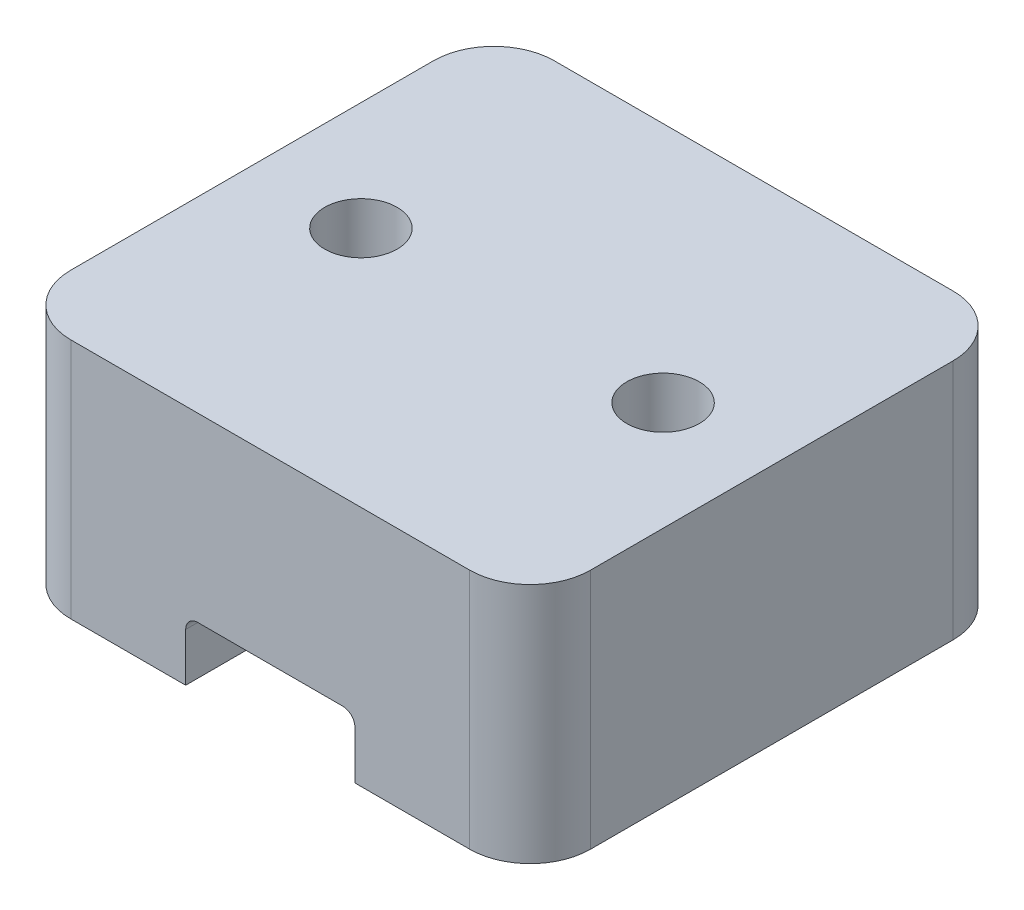
ISO-10303-21;
HEADER;
FILE_DESCRIPTION(('STEP AP214'),'2;1');
FILE_NAME('part.step','',(''),(''),'','','');
FILE_SCHEMA(('AUTOMOTIVE_DESIGN { 1 0 10303 214 1 1 1 1 }'));
ENDSEC;
DATA;
#1=APPLICATION_CONTEXT('core data for automotive mechanical design processes');
#2=APPLICATION_PROTOCOL_DEFINITION('international standard','automotive_design',2000,#1);
#3=PRODUCT_CONTEXT('',#1,'mechanical');
#4=PRODUCT('Part','Part','',(#3));
#5=PRODUCT_RELATED_PRODUCT_CATEGORY('part','',(#4));
#6=PRODUCT_DEFINITION_FORMATION('','',#4);
#7=PRODUCT_DEFINITION_CONTEXT('part definition',#1,'design');
#8=PRODUCT_DEFINITION('design','',#6,#7);
#9=PRODUCT_DEFINITION_SHAPE('','',#8);
#10=(LENGTH_UNIT() NAMED_UNIT(*) SI_UNIT(.MILLI.,.METRE.));
#11=(NAMED_UNIT(*) PLANE_ANGLE_UNIT() SI_UNIT($,.RADIAN.));
#12=(NAMED_UNIT(*) SI_UNIT($,.STERADIAN.) SOLID_ANGLE_UNIT());
#13=UNCERTAINTY_MEASURE_WITH_UNIT(LENGTH_MEASURE(1.E-05),#10,'distance_accuracy_value','');
#14=(GEOMETRIC_REPRESENTATION_CONTEXT(3) GLOBAL_UNCERTAINTY_ASSIGNED_CONTEXT((#13)) GLOBAL_UNIT_ASSIGNED_CONTEXT((#10,
#11,#12)) REPRESENTATION_CONTEXT('',''));
#15=CARTESIAN_POINT('',(0.,0.,0.));
#16=DIRECTION('',(0.,0.,1.));
#17=DIRECTION('',(1.,0.,0.));
#18=AXIS2_PLACEMENT_3D('',#15,#16,#17);
#19=CARTESIAN_POINT('',(0.,0.,0.));
#20=DIRECTION('',(0.,-1.,0.));
#21=DIRECTION('',(0.,0.,-1.));
#22=AXIS2_PLACEMENT_3D('',#19,#20,#21);
#23=PLANE('',#22);
#24=DIRECTION('',(0.,0.,1.));
#25=VECTOR('',#24,1.);
#26=CARTESIAN_POINT('',(14.5,0.,-40.001));
#27=LINE('',#26,#25);
#28=CARTESIAN_POINT('',(14.5,0.,-40.));
#29=VERTEX_POINT('',#28);
#30=CARTESIAN_POINT('',(14.5,0.,0.));
#31=VERTEX_POINT('',#30);
#32=EDGE_CURVE('E132',#29,#31,#27,.T.);
#33=ORIENTED_EDGE('',*,*,#32,.T.);
#34=DIRECTION('',(1.,0.,0.));
#35=VECTOR('',#34,1.);
#36=CARTESIAN_POINT('',(0.,0.,0.));
#37=LINE('',#36,#35);
#38=CARTESIAN_POINT('',(5.,0.,0.));
#39=VERTEX_POINT('',#38);
#40=EDGE_CURVE('E159',#39,#31,#37,.T.);
#41=ORIENTED_EDGE('',*,*,#40,.F.);
#42=CARTESIAN_POINT('',(5.,0.,-5.));
#43=DIRECTION('',(0.,-1.,0.));
#44=DIRECTION('',(0.,0.,-1.));
#45=AXIS2_PLACEMENT_3D('',#42,#43,#44);
#46=CIRCLE('',#45,5.);
#47=CARTESIAN_POINT('',(0.,0.,-5.));
#48=VERTEX_POINT('',#47);
#49=EDGE_CURVE('E169',#39,#48,#46,.T.);
#50=ORIENTED_EDGE('',*,*,#49,.T.);
#51=DIRECTION('',(0.,0.,1.));
#52=VECTOR('',#51,1.);
#53=CARTESIAN_POINT('',(0.,0.,0.));
#54=LINE('',#53,#52);
#55=CARTESIAN_POINT('',(0.,0.,-35.));
#56=VERTEX_POINT('',#55);
#57=EDGE_CURVE('E270',#56,#48,#54,.T.);
#58=ORIENTED_EDGE('',*,*,#57,.F.);
#59=CARTESIAN_POINT('',(5.,0.,-35.));
#60=DIRECTION('',(0.,-1.,0.));
#61=DIRECTION('',(0.,0.,-1.));
#62=AXIS2_PLACEMENT_3D('',#59,#60,#61);
#63=CIRCLE('',#62,5.);
#64=CARTESIAN_POINT('',(5.,0.,-40.));
#65=VERTEX_POINT('',#64);
#66=EDGE_CURVE('E151',#56,#65,#63,.T.);
#67=ORIENTED_EDGE('',*,*,#66,.T.);
#68=DIRECTION('',(-1.,0.,0.));
#69=VECTOR('',#68,1.);
#70=CARTESIAN_POINT('',(0.,0.,-40.));
#71=LINE('',#70,#69);
#72=EDGE_CURVE('E145',#29,#65,#71,.T.);
#73=ORIENTED_EDGE('',*,*,#72,.F.);
#74=EDGE_LOOP('',(#33,#41,#50,#58,#67,#73));
#75=FACE_BOUND('',#74,.T.);
#76=CARTESIAN_POINT('',(9.,0.,-20.));
#77=DIRECTION('',(0.,-1.,0.));
#78=DIRECTION('',(0.,0.,-1.));
#79=AXIS2_PLACEMENT_3D('',#76,#77,#78);
#80=CIRCLE('',#79,3.);
#81=CARTESIAN_POINT('',(9.,0.,-23.));
#82=VERTEX_POINT('',#81);
#83=EDGE_CURVE('E263',#82,#82,#80,.F.);
#84=ORIENTED_EDGE('',*,*,#83,.T.);
#85=EDGE_LOOP('',(#84));
#86=FACE_BOUND('',#85,.T.);
#87=ADVANCED_FACE('F32',(#75,#86),#23,.T.);
#88=CARTESIAN_POINT('',(0.,20.,0.));
#89=DIRECTION('',(1.,0.,0.));
#90=DIRECTION('',(0.,0.,-1.));
#91=AXIS2_PLACEMENT_3D('',#88,#89,#90);
#92=PLANE('',#91);
#93=DIRECTION('',(0.,0.,1.));
#94=VECTOR('',#93,1.);
#95=CARTESIAN_POINT('',(0.,20.,0.));
#96=LINE('',#95,#94);
#97=CARTESIAN_POINT('',(0.,20.,-35.));
#98=VERTEX_POINT('',#97);
#99=CARTESIAN_POINT('',(0.,20.,-5.));
#100=VERTEX_POINT('',#99);
#101=EDGE_CURVE('E157',#98,#100,#96,.T.);
#102=ORIENTED_EDGE('',*,*,#101,.F.);
#103=DIRECTION('',(0.,-1.,0.));
#104=VECTOR('',#103,1.);
#105=CARTESIAN_POINT('',(0.,20.,-35.));
#106=LINE('',#105,#104);
#107=EDGE_CURVE('E165',#98,#56,#106,.T.);
#108=ORIENTED_EDGE('',*,*,#107,.T.);
#109=ORIENTED_EDGE('',*,*,#57,.T.);
#110=DIRECTION('',(0.,-1.,0.));
#111=VECTOR('',#110,1.);
#112=CARTESIAN_POINT('',(0.,20.,-5.));
#113=LINE('',#112,#111);
#114=EDGE_CURVE('E163',#48,#100,#113,.F.);
#115=ORIENTED_EDGE('',*,*,#114,.T.);
#116=EDGE_LOOP('',(#102,#108,#109,#115));
#117=FACE_BOUND('',#116,.T.);
#118=ADVANCED_FACE('F230',(#117),#92,.F.);
#119=CARTESIAN_POINT('',(0.,20.,0.));
#120=DIRECTION('',(0.,0.,-1.));
#121=DIRECTION('',(-1.,0.,0.));
#122=AXIS2_PLACEMENT_3D('',#119,#120,#121);
#123=PLANE('',#122);
#124=ORIENTED_EDGE('',*,*,#40,.T.);
#125=DIRECTION('',(0.,-1.,0.));
#126=VECTOR('',#125,1.);
#127=CARTESIAN_POINT('',(14.5,0.,0.));
#128=LINE('',#127,#126);
#129=CARTESIAN_POINT('',(14.5,4.,0.));
#130=VERTEX_POINT('',#129);
#131=EDGE_CURVE('E136',#130,#31,#128,.T.);
#132=ORIENTED_EDGE('',*,*,#131,.F.);
#133=CARTESIAN_POINT('',(15.5,4.,0.));
#134=DIRECTION('',(0.,0.,-1.));
#135=DIRECTION('',(-1.,0.,0.));
#136=AXIS2_PLACEMENT_3D('',#133,#134,#135);
#137=CIRCLE('',#136,1.);
#138=CARTESIAN_POINT('',(15.5,5.,0.));
#139=VERTEX_POINT('',#138);
#140=EDGE_CURVE('E40',#130,#139,#137,.T.);
#141=ORIENTED_EDGE('',*,*,#140,.T.);
#142=DIRECTION('',(-1.,0.,0.));
#143=VECTOR('',#142,1.);
#144=CARTESIAN_POINT('',(14.5,5.,0.));
#145=LINE('',#144,#143);
#146=CARTESIAN_POINT('',(27.5,5.,0.));
#147=VERTEX_POINT('',#146);
#148=EDGE_CURVE('E142',#147,#139,#145,.T.);
#149=ORIENTED_EDGE('',*,*,#148,.F.);
#150=CARTESIAN_POINT('',(27.5,4.,0.));
#151=DIRECTION('',(0.,0.,-1.));
#152=DIRECTION('',(-1.,0.,0.));
#153=AXIS2_PLACEMENT_3D('',#150,#151,#152);
#154=CIRCLE('',#153,1.);
#155=CARTESIAN_POINT('',(28.5,4.,0.));
#156=VERTEX_POINT('',#155);
#157=EDGE_CURVE('E209',#147,#156,#154,.T.);
#158=ORIENTED_EDGE('',*,*,#157,.T.);
#159=DIRECTION('',(0.,1.,0.));
#160=VECTOR('',#159,1.);
#161=CARTESIAN_POINT('',(28.5,0.,0.));
#162=LINE('',#161,#160);
#163=CARTESIAN_POINT('',(28.5,0.,0.));
#164=VERTEX_POINT('',#163);
#165=EDGE_CURVE('E220',#164,#156,#162,.T.);
#166=ORIENTED_EDGE('',*,*,#165,.F.);
#167=CARTESIAN_POINT('',(38.,0.,0.));
#168=VERTEX_POINT('',#167);
#169=EDGE_CURVE('E284',#164,#168,#37,.T.);
#170=ORIENTED_EDGE('',*,*,#169,.T.);
#171=DIRECTION('',(0.,-1.,0.));
#172=VECTOR('',#171,1.);
#173=CARTESIAN_POINT('',(38.,20.,0.));
#174=LINE('',#173,#172);
#175=CARTESIAN_POINT('',(38.,20.,0.));
#176=VERTEX_POINT('',#175);
#177=EDGE_CURVE('E198',#168,#176,#174,.F.);
#178=ORIENTED_EDGE('',*,*,#177,.T.);
#179=DIRECTION('',(1.,0.,0.));
#180=VECTOR('',#179,1.);
#181=CARTESIAN_POINT('',(0.,20.,0.));
#182=LINE('',#181,#180);
#183=CARTESIAN_POINT('',(5.,20.,0.));
#184=VERTEX_POINT('',#183);
#185=EDGE_CURVE('E275',#184,#176,#182,.T.);
#186=ORIENTED_EDGE('',*,*,#185,.F.);
#187=DIRECTION('',(0.,-1.,0.));
#188=VECTOR('',#187,1.);
#189=CARTESIAN_POINT('',(5.,20.,0.));
#190=LINE('',#189,#188);
#191=EDGE_CURVE('E195',#184,#39,#190,.T.);
#192=ORIENTED_EDGE('',*,*,#191,.T.);
#193=EDGE_LOOP('',(#124,#132,#141,#149,#158,#166,#170,#178,#186,#192));
#194=FACE_BOUND('',#193,.T.);
#195=ADVANCED_FACE('F215',(#194),#123,.F.);
#196=CARTESIAN_POINT('',(43.,20.,0.));
#197=DIRECTION('',(-1.,0.,0.));
#198=DIRECTION('',(0.,0.,1.));
#199=AXIS2_PLACEMENT_3D('',#196,#197,#198);
#200=PLANE('',#199);
#201=DIRECTION('',(0.,0.,-1.));
#202=VECTOR('',#201,1.);
#203=CARTESIAN_POINT('',(43.,0.,0.));
#204=LINE('',#203,#202);
#205=CARTESIAN_POINT('',(43.,0.,-5.));
#206=VERTEX_POINT('',#205);
#207=CARTESIAN_POINT('',(43.,0.,-35.));
#208=VERTEX_POINT('',#207);
#209=EDGE_CURVE('E154',#206,#208,#204,.T.);
#210=ORIENTED_EDGE('',*,*,#209,.T.);
#211=DIRECTION('',(0.,-1.,0.));
#212=VECTOR('',#211,1.);
#213=CARTESIAN_POINT('',(43.,20.,-35.));
#214=LINE('',#213,#212);
#215=CARTESIAN_POINT('',(43.,20.,-35.));
#216=VERTEX_POINT('',#215);
#217=EDGE_CURVE('E193',#208,#216,#214,.F.);
#218=ORIENTED_EDGE('',*,*,#217,.T.);
#219=DIRECTION('',(0.,0.,-1.));
#220=VECTOR('',#219,1.);
#221=CARTESIAN_POINT('',(43.,20.,0.));
#222=LINE('',#221,#220);
#223=CARTESIAN_POINT('',(43.,20.,-5.));
#224=VERTEX_POINT('',#223);
#225=EDGE_CURVE('E278',#224,#216,#222,.T.);
#226=ORIENTED_EDGE('',*,*,#225,.F.);
#227=DIRECTION('',(0.,-1.,0.));
#228=VECTOR('',#227,1.);
#229=CARTESIAN_POINT('',(43.,20.,-5.));
#230=LINE('',#229,#228);
#231=EDGE_CURVE('E190',#224,#206,#230,.T.);
#232=ORIENTED_EDGE('',*,*,#231,.T.);
#233=EDGE_LOOP('',(#210,#218,#226,#232));
#234=FACE_BOUND('',#233,.T.);
#235=ADVANCED_FACE('F298',(#234),#200,.F.);
#236=CARTESIAN_POINT('',(0.,20.,-40.));
#237=DIRECTION('',(0.,0.,1.));
#238=DIRECTION('',(1.,0.,0.));
#239=AXIS2_PLACEMENT_3D('',#236,#237,#238);
#240=PLANE('',#239);
#241=DIRECTION('',(1.,0.,0.));
#242=VECTOR('',#241,1.);
#243=CARTESIAN_POINT('',(14.5,5.,-40.));
#244=LINE('',#243,#242);
#245=CARTESIAN_POINT('',(15.5,5.,-40.));
#246=VERTEX_POINT('',#245);
#247=CARTESIAN_POINT('',(27.5,5.,-40.));
#248=VERTEX_POINT('',#247);
#249=EDGE_CURVE('E147',#246,#248,#244,.T.);
#250=ORIENTED_EDGE('',*,*,#249,.F.);
#251=CARTESIAN_POINT('',(15.5,4.,-40.));
#252=DIRECTION('',(0.,0.,1.));
#253=DIRECTION('',(1.,0.,0.));
#254=AXIS2_PLACEMENT_3D('',#251,#252,#253);
#255=CIRCLE('',#254,1.);
#256=CARTESIAN_POINT('',(14.5,4.,-40.));
#257=VERTEX_POINT('',#256);
#258=EDGE_CURVE('E11',#246,#257,#255,.T.);
#259=ORIENTED_EDGE('',*,*,#258,.T.);
#260=DIRECTION('',(0.,1.,0.));
#261=VECTOR('',#260,1.);
#262=CARTESIAN_POINT('',(14.5,0.,-40.));
#263=LINE('',#262,#261);
#264=EDGE_CURVE('E134',#29,#257,#263,.T.);
#265=ORIENTED_EDGE('',*,*,#264,.F.);
#266=ORIENTED_EDGE('',*,*,#72,.T.);
#267=DIRECTION('',(0.,-1.,0.));
#268=VECTOR('',#267,1.);
#269=CARTESIAN_POINT('',(5.,20.,-40.));
#270=LINE('',#269,#268);
#271=CARTESIAN_POINT('',(5.,20.,-40.));
#272=VERTEX_POINT('',#271);
#273=EDGE_CURVE('E180',#65,#272,#270,.F.);
#274=ORIENTED_EDGE('',*,*,#273,.T.);
#275=DIRECTION('',(-1.,0.,0.));
#276=VECTOR('',#275,1.);
#277=CARTESIAN_POINT('',(0.,20.,-40.));
#278=LINE('',#277,#276);
#279=CARTESIAN_POINT('',(38.,20.,-40.));
#280=VERTEX_POINT('',#279);
#281=EDGE_CURVE('E166',#280,#272,#278,.T.);
#282=ORIENTED_EDGE('',*,*,#281,.F.);
#283=DIRECTION('',(0.,-1.,0.));
#284=VECTOR('',#283,1.);
#285=CARTESIAN_POINT('',(38.,20.,-40.));
#286=LINE('',#285,#284);
#287=CARTESIAN_POINT('',(38.,0.,-40.));
#288=VERTEX_POINT('',#287);
#289=EDGE_CURVE('E177',#280,#288,#286,.T.);
#290=ORIENTED_EDGE('',*,*,#289,.T.);
#291=CARTESIAN_POINT('',(28.5,0.,-40.));
#292=VERTEX_POINT('',#291);
#293=EDGE_CURVE('E153',#288,#292,#71,.T.);
#294=ORIENTED_EDGE('',*,*,#293,.T.);
#295=DIRECTION('',(0.,-1.,0.));
#296=VECTOR('',#295,1.);
#297=CARTESIAN_POINT('',(28.5,0.,-40.));
#298=LINE('',#297,#296);
#299=CARTESIAN_POINT('',(28.5,4.,-40.));
#300=VERTEX_POINT('',#299);
#301=EDGE_CURVE('E439',#300,#292,#298,.T.);
#302=ORIENTED_EDGE('',*,*,#301,.F.);
#303=CARTESIAN_POINT('',(27.5,4.,-40.));
#304=DIRECTION('',(0.,0.,1.));
#305=DIRECTION('',(1.,0.,0.));
#306=AXIS2_PLACEMENT_3D('',#303,#304,#305);
#307=CIRCLE('',#306,1.);
#308=EDGE_CURVE('E211',#300,#248,#307,.T.);
#309=ORIENTED_EDGE('',*,*,#308,.T.);
#310=EDGE_LOOP('',(#250,#259,#265,#266,#274,#282,#290,#294,#302,#309));
#311=FACE_BOUND('',#310,.T.);
#312=ADVANCED_FACE('F144',(#311),#240,.F.);
#313=CARTESIAN_POINT('',(0.,20.,0.));
#314=DIRECTION('',(0.,-1.,0.));
#315=DIRECTION('',(0.,0.,-1.));
#316=AXIS2_PLACEMENT_3D('',#313,#314,#315);
#317=PLANE('',#316);
#318=CARTESIAN_POINT('',(34.,20.,-20.));
#319=DIRECTION('',(0.,1.,0.));
#320=DIRECTION('',(0.,0.,1.));
#321=AXIS2_PLACEMENT_3D('',#318,#319,#320);
#322=CIRCLE('',#321,3.);
#323=CARTESIAN_POINT('',(34.,20.,-17.));
#324=VERTEX_POINT('',#323);
#325=EDGE_CURVE('E260',#324,#324,#322,.T.);
#326=ORIENTED_EDGE('',*,*,#325,.F.);
#327=EDGE_LOOP('',(#326));
#328=FACE_BOUND('',#327,.T.);
#329=CARTESIAN_POINT('',(9.,20.,-20.));
#330=DIRECTION('',(0.,1.,0.));
#331=DIRECTION('',(0.,0.,1.));
#332=AXIS2_PLACEMENT_3D('',#329,#330,#331);
#333=CIRCLE('',#332,3.);
#334=CARTESIAN_POINT('',(9.,20.,-17.));
#335=VERTEX_POINT('',#334);
#336=EDGE_CURVE('E267',#335,#335,#333,.T.);
#337=ORIENTED_EDGE('',*,*,#336,.F.);
#338=EDGE_LOOP('',(#337));
#339=FACE_BOUND('',#338,.T.);
#340=ORIENTED_EDGE('',*,*,#281,.T.);
#341=CARTESIAN_POINT('',(5.,20.,-35.));
#342=DIRECTION('',(0.,-1.,0.));
#343=DIRECTION('',(0.,0.,-1.));
#344=AXIS2_PLACEMENT_3D('',#341,#342,#343);
#345=CIRCLE('',#344,5.);
#346=EDGE_CURVE('E188',#272,#98,#345,.F.);
#347=ORIENTED_EDGE('',*,*,#346,.T.);
#348=ORIENTED_EDGE('',*,*,#101,.T.);
#349=CARTESIAN_POINT('',(5.,20.,-5.));
#350=DIRECTION('',(0.,-1.,0.));
#351=DIRECTION('',(0.,0.,-1.));
#352=AXIS2_PLACEMENT_3D('',#349,#350,#351);
#353=CIRCLE('',#352,5.);
#354=EDGE_CURVE('E182',#100,#184,#353,.F.);
#355=ORIENTED_EDGE('',*,*,#354,.T.);
#356=ORIENTED_EDGE('',*,*,#185,.T.);
#357=CARTESIAN_POINT('',(38.,20.,-5.));
#358=DIRECTION('',(0.,-1.,0.));
#359=DIRECTION('',(0.,0.,-1.));
#360=AXIS2_PLACEMENT_3D('',#357,#358,#359);
#361=CIRCLE('',#360,5.);
#362=EDGE_CURVE('E184',#176,#224,#361,.F.);
#363=ORIENTED_EDGE('',*,*,#362,.T.);
#364=ORIENTED_EDGE('',*,*,#225,.T.);
#365=CARTESIAN_POINT('',(38.,20.,-35.));
#366=DIRECTION('',(0.,-1.,0.));
#367=DIRECTION('',(0.,0.,-1.));
#368=AXIS2_PLACEMENT_3D('',#365,#366,#367);
#369=CIRCLE('',#368,5.);
#370=EDGE_CURVE('E186',#216,#280,#369,.F.);
#371=ORIENTED_EDGE('',*,*,#370,.T.);
#372=EDGE_LOOP('',(#340,#347,#348,#355,#356,#363,#364,#371));
#373=FACE_BOUND('',#372,.T.);
#374=ADVANCED_FACE('F242',(#328,#339,#373),#317,.F.);
#375=DIRECTION('',(0.,0.,1.));
#376=VECTOR('',#375,1.);
#377=CARTESIAN_POINT('',(28.5,0.,-40.001));
#378=LINE('',#377,#376);
#379=EDGE_CURVE('E141',#292,#164,#378,.T.);
#380=ORIENTED_EDGE('',*,*,#379,.F.);
#381=ORIENTED_EDGE('',*,*,#293,.F.);
#382=CARTESIAN_POINT('',(38.,0.,-35.));
#383=DIRECTION('',(0.,-1.,0.));
#384=DIRECTION('',(0.,0.,-1.));
#385=AXIS2_PLACEMENT_3D('',#382,#383,#384);
#386=CIRCLE('',#385,5.);
#387=EDGE_CURVE('E174',#288,#208,#386,.T.);
#388=ORIENTED_EDGE('',*,*,#387,.T.);
#389=ORIENTED_EDGE('',*,*,#209,.F.);
#390=CARTESIAN_POINT('',(38.,0.,-5.));
#391=DIRECTION('',(0.,-1.,0.));
#392=DIRECTION('',(0.,0.,-1.));
#393=AXIS2_PLACEMENT_3D('',#390,#391,#392);
#394=CIRCLE('',#393,5.);
#395=EDGE_CURVE('E171',#206,#168,#394,.T.);
#396=ORIENTED_EDGE('',*,*,#395,.T.);
#397=ORIENTED_EDGE('',*,*,#169,.F.);
#398=EDGE_LOOP('',(#380,#381,#388,#389,#396,#397));
#399=FACE_BOUND('',#398,.T.);
#400=CARTESIAN_POINT('',(34.,0.,-20.));
#401=DIRECTION('',(0.,-1.,0.));
#402=DIRECTION('',(0.,0.,-1.));
#403=AXIS2_PLACEMENT_3D('',#400,#401,#402);
#404=CIRCLE('',#403,3.);
#405=CARTESIAN_POINT('',(34.,0.,-23.));
#406=VERTEX_POINT('',#405);
#407=EDGE_CURVE('E258',#406,#406,#404,.F.);
#408=ORIENTED_EDGE('',*,*,#407,.T.);
#409=EDGE_LOOP('',(#408));
#410=FACE_BOUND('',#409,.T.);
#411=ADVANCED_FACE('F232',(#399,#410),#23,.T.);
#412=CARTESIAN_POINT('',(9.,-0.001000000000001,-20.));
#413=DIRECTION('',(0.,1.,0.));
#414=DIRECTION('',(0.,0.,1.));
#415=AXIS2_PLACEMENT_3D('',#412,#413,#414);
#416=CYLINDRICAL_SURFACE('',#415,3.);
#417=ORIENTED_EDGE('',*,*,#83,.F.);
#418=EDGE_LOOP('',(#417));
#419=FACE_BOUND('',#418,.T.);
#420=ORIENTED_EDGE('',*,*,#336,.T.);
#421=EDGE_LOOP('',(#420));
#422=FACE_BOUND('',#421,.T.);
#423=ADVANCED_FACE('F241',(#419,#422),#416,.F.);
#424=CARTESIAN_POINT('',(34.,-0.001000000000001,-20.));
#425=DIRECTION('',(0.,1.,0.));
#426=DIRECTION('',(0.,0.,1.));
#427=AXIS2_PLACEMENT_3D('',#424,#425,#426);
#428=CYLINDRICAL_SURFACE('',#427,3.);
#429=ORIENTED_EDGE('',*,*,#407,.F.);
#430=EDGE_LOOP('',(#429));
#431=FACE_BOUND('',#430,.T.);
#432=ORIENTED_EDGE('',*,*,#325,.T.);
#433=EDGE_LOOP('',(#432));
#434=FACE_BOUND('',#433,.T.);
#435=ADVANCED_FACE('F248',(#431,#434),#428,.F.);
#436=CARTESIAN_POINT('',(5.,20.,-35.));
#437=DIRECTION('',(0.,-1.,0.));
#438=DIRECTION('',(0.,0.,-1.));
#439=AXIS2_PLACEMENT_3D('',#436,#437,#438);
#440=CYLINDRICAL_SURFACE('',#439,5.);
#441=ORIENTED_EDGE('',*,*,#346,.F.);
#442=ORIENTED_EDGE('',*,*,#273,.F.);
#443=ORIENTED_EDGE('',*,*,#66,.F.);
#444=ORIENTED_EDGE('',*,*,#107,.F.);
#445=EDGE_LOOP('',(#441,#442,#443,#444));
#446=FACE_BOUND('',#445,.T.);
#447=ADVANCED_FACE('F306',(#446),#440,.T.);
#448=CARTESIAN_POINT('',(38.,20.,-35.));
#449=DIRECTION('',(0.,-1.,0.));
#450=DIRECTION('',(0.,0.,-1.));
#451=AXIS2_PLACEMENT_3D('',#448,#449,#450);
#452=CYLINDRICAL_SURFACE('',#451,5.);
#453=ORIENTED_EDGE('',*,*,#370,.F.);
#454=ORIENTED_EDGE('',*,*,#217,.F.);
#455=ORIENTED_EDGE('',*,*,#387,.F.);
#456=ORIENTED_EDGE('',*,*,#289,.F.);
#457=EDGE_LOOP('',(#453,#454,#455,#456));
#458=FACE_BOUND('',#457,.T.);
#459=ADVANCED_FACE('F301',(#458),#452,.T.);
#460=CARTESIAN_POINT('',(38.,20.,-5.));
#461=DIRECTION('',(0.,-1.,0.));
#462=DIRECTION('',(0.,0.,-1.));
#463=AXIS2_PLACEMENT_3D('',#460,#461,#462);
#464=CYLINDRICAL_SURFACE('',#463,5.);
#465=ORIENTED_EDGE('',*,*,#362,.F.);
#466=ORIENTED_EDGE('',*,*,#177,.F.);
#467=ORIENTED_EDGE('',*,*,#395,.F.);
#468=ORIENTED_EDGE('',*,*,#231,.F.);
#469=EDGE_LOOP('',(#465,#466,#467,#468));
#470=FACE_BOUND('',#469,.T.);
#471=ADVANCED_FACE('F293',(#470),#464,.T.);
#472=CARTESIAN_POINT('',(5.,20.,-5.));
#473=DIRECTION('',(0.,-1.,0.));
#474=DIRECTION('',(0.,0.,-1.));
#475=AXIS2_PLACEMENT_3D('',#472,#473,#474);
#476=CYLINDRICAL_SURFACE('',#475,5.);
#477=ORIENTED_EDGE('',*,*,#354,.F.);
#478=ORIENTED_EDGE('',*,*,#114,.F.);
#479=ORIENTED_EDGE('',*,*,#49,.F.);
#480=ORIENTED_EDGE('',*,*,#191,.F.);
#481=EDGE_LOOP('',(#477,#478,#479,#480));
#482=FACE_BOUND('',#481,.T.);
#483=ADVANCED_FACE('F312',(#482),#476,.T.);
#484=CARTESIAN_POINT('',(14.5,0.,-40.001));
#485=DIRECTION('',(-1.,0.,0.));
#486=DIRECTION('',(0.,0.,1.));
#487=AXIS2_PLACEMENT_3D('',#484,#485,#486);
#488=PLANE('',#487);
#489=ORIENTED_EDGE('',*,*,#264,.T.);
#490=DIRECTION('',(0.,0.,1.));
#491=VECTOR('',#490,1.);
#492=CARTESIAN_POINT('',(14.5,4.,0.));
#493=LINE('',#492,#491);
#494=EDGE_CURVE('E207',#257,#130,#493,.T.);
#495=ORIENTED_EDGE('',*,*,#494,.T.);
#496=ORIENTED_EDGE('',*,*,#131,.T.);
#497=ORIENTED_EDGE('',*,*,#32,.F.);
#498=EDGE_LOOP('',(#489,#495,#496,#497));
#499=FACE_BOUND('',#498,.T.);
#500=ADVANCED_FACE('F133',(#499),#488,.F.);
#501=CARTESIAN_POINT('',(14.5,5.,-40.001));
#502=DIRECTION('',(0.,1.,0.));
#503=DIRECTION('',(-1.,0.,0.));
#504=AXIS2_PLACEMENT_3D('',#501,#502,#503);
#505=PLANE('',#504);
#506=ORIENTED_EDGE('',*,*,#249,.T.);
#507=DIRECTION('',(0.,0.,1.));
#508=VECTOR('',#507,1.);
#509=CARTESIAN_POINT('',(27.5,5.,0.));
#510=LINE('',#509,#508);
#511=EDGE_CURVE('E202',#248,#147,#510,.T.);
#512=ORIENTED_EDGE('',*,*,#511,.T.);
#513=ORIENTED_EDGE('',*,*,#148,.T.);
#514=DIRECTION('',(0.,0.,1.));
#515=VECTOR('',#514,1.);
#516=CARTESIAN_POINT('',(15.5,5.,-40.));
#517=LINE('',#516,#515);
#518=EDGE_CURVE('E200',#139,#246,#517,.F.);
#519=ORIENTED_EDGE('',*,*,#518,.T.);
#520=EDGE_LOOP('',(#506,#512,#513,#519));
#521=FACE_BOUND('',#520,.T.);
#522=ADVANCED_FACE('F218',(#521),#505,.F.);
#523=CARTESIAN_POINT('',(28.5,0.,-40.001));
#524=DIRECTION('',(1.,0.,0.));
#525=DIRECTION('',(0.,0.,-1.));
#526=AXIS2_PLACEMENT_3D('',#523,#524,#525);
#527=PLANE('',#526);
#528=ORIENTED_EDGE('',*,*,#165,.T.);
#529=DIRECTION('',(0.,0.,1.));
#530=VECTOR('',#529,1.);
#531=CARTESIAN_POINT('',(28.5,4.,-40.));
#532=LINE('',#531,#530);
#533=EDGE_CURVE('E205',#156,#300,#532,.F.);
#534=ORIENTED_EDGE('',*,*,#533,.T.);
#535=ORIENTED_EDGE('',*,*,#301,.T.);
#536=ORIENTED_EDGE('',*,*,#379,.T.);
#537=EDGE_LOOP('',(#528,#534,#535,#536));
#538=FACE_BOUND('',#537,.T.);
#539=ADVANCED_FACE('F227',(#538),#527,.F.);
#540=CARTESIAN_POINT('',(27.5,4.,-40.001));
#541=DIRECTION('',(0.,0.,-1.));
#542=DIRECTION('',(-1.,0.,0.));
#543=AXIS2_PLACEMENT_3D('',#540,#541,#542);
#544=CYLINDRICAL_SURFACE('',#543,1.);
#545=ORIENTED_EDGE('',*,*,#308,.F.);
#546=ORIENTED_EDGE('',*,*,#533,.F.);
#547=ORIENTED_EDGE('',*,*,#157,.F.);
#548=ORIENTED_EDGE('',*,*,#511,.F.);
#549=EDGE_LOOP('',(#545,#546,#547,#548));
#550=FACE_BOUND('',#549,.T.);
#551=ADVANCED_FACE('F223',(#550),#544,.F.);
#552=CARTESIAN_POINT('',(15.5,4.,-40.001));
#553=DIRECTION('',(0.,0.,-1.));
#554=DIRECTION('',(-1.,0.,0.));
#555=AXIS2_PLACEMENT_3D('',#552,#553,#554);
#556=CYLINDRICAL_SURFACE('',#555,1.);
#557=ORIENTED_EDGE('',*,*,#258,.F.);
#558=ORIENTED_EDGE('',*,*,#518,.F.);
#559=ORIENTED_EDGE('',*,*,#140,.F.);
#560=ORIENTED_EDGE('',*,*,#494,.F.);
#561=EDGE_LOOP('',(#557,#558,#559,#560));
#562=FACE_BOUND('',#561,.T.);
#563=ADVANCED_FACE('F34',(#562),#556,.F.);
#564=CLOSED_SHELL('',(#87,#118,#195,#235,#312,#374,#411,#423,#435,#447,#459,#471,#483,#500,#522,
#539,#551,#563));
#565=MANIFOLD_SOLID_BREP('B2',#564);
#566=ADVANCED_BREP_SHAPE_REPRESENTATION('',(#18,#565),#14);
#567=SHAPE_DEFINITION_REPRESENTATION(#9,#566);
ENDSEC;
END-ISO-10303-21;
